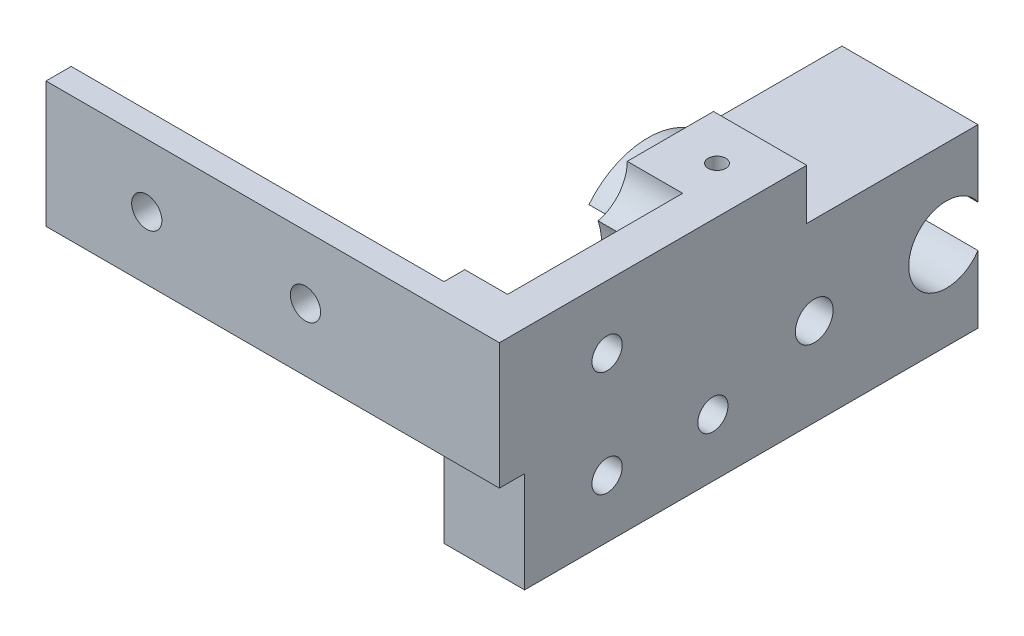
ISO-10303-21;
HEADER;
FILE_DESCRIPTION(('STEP AP214'),'2;1');
FILE_NAME('part.step','',(''),(''),'','','');
FILE_SCHEMA(('AUTOMOTIVE_DESIGN { 1 0 10303 214 1 1 1 1 }'));
ENDSEC;
DATA;
#1=APPLICATION_CONTEXT('core data for automotive mechanical design processes');
#2=APPLICATION_PROTOCOL_DEFINITION('international standard','automotive_design',2000,#1);
#3=PRODUCT_CONTEXT('',#1,'mechanical');
#4=PRODUCT('Part','Part','',(#3));
#5=PRODUCT_RELATED_PRODUCT_CATEGORY('part','',(#4));
#6=PRODUCT_DEFINITION_FORMATION('','',#4);
#7=PRODUCT_DEFINITION_CONTEXT('part definition',#1,'design');
#8=PRODUCT_DEFINITION('design','',#6,#7);
#9=PRODUCT_DEFINITION_SHAPE('','',#8);
#10=(LENGTH_UNIT() NAMED_UNIT(*) SI_UNIT(.MILLI.,.METRE.));
#11=(NAMED_UNIT(*) PLANE_ANGLE_UNIT() SI_UNIT($,.RADIAN.));
#12=(NAMED_UNIT(*) SI_UNIT($,.STERADIAN.) SOLID_ANGLE_UNIT());
#13=UNCERTAINTY_MEASURE_WITH_UNIT(LENGTH_MEASURE(1.E-05),#10,'distance_accuracy_value','');
#14=(GEOMETRIC_REPRESENTATION_CONTEXT(3) GLOBAL_UNCERTAINTY_ASSIGNED_CONTEXT((#13)) GLOBAL_UNIT_ASSIGNED_CONTEXT((#10,
#11,#12)) REPRESENTATION_CONTEXT('',''));
#15=CARTESIAN_POINT('',(0.,0.,0.));
#16=DIRECTION('',(0.,0.,1.));
#17=DIRECTION('',(1.,0.,0.));
#18=AXIS2_PLACEMENT_3D('',#15,#16,#17);
#19=CARTESIAN_POINT('',(1.7,-5.5,1.25));
#20=DIRECTION('',(1.,0.,0.));
#21=DIRECTION('',(0.,0.,-1.));
#22=AXIS2_PLACEMENT_3D('',#19,#20,#21);
#23=CYLINDRICAL_SURFACE('',#22,0.6);
#24=CARTESIAN_POINT('',(2.9,-5.5,1.25));
#25=DIRECTION('',(1.,0.,0.));
#26=DIRECTION('',(0.,0.,-1.));
#27=AXIS2_PLACEMENT_3D('',#24,#25,#26);
#28=CIRCLE('',#27,0.6);
#29=CARTESIAN_POINT('',(2.9,-5.5,0.650000000000001));
#30=VERTEX_POINT('',#29);
#31=EDGE_CURVE('E307',#30,#30,#28,.T.);
#32=ORIENTED_EDGE('',*,*,#31,.F.);
#33=EDGE_LOOP('',(#32));
#34=FACE_BOUND('',#33,.T.);
#35=CARTESIAN_POINT('',(4.9,-5.5,1.25));
#36=DIRECTION('',(1.,0.,0.));
#37=DIRECTION('',(0.,0.,-1.));
#38=AXIS2_PLACEMENT_3D('',#35,#36,#37);
#39=CIRCLE('',#38,0.6);
#40=CARTESIAN_POINT('',(4.9,-5.5,0.650000000000001));
#41=VERTEX_POINT('',#40);
#42=EDGE_CURVE('E73',#41,#41,#39,.F.);
#43=ORIENTED_EDGE('',*,*,#42,.F.);
#44=EDGE_LOOP('',(#43));
#45=FACE_BOUND('',#44,.T.);
#46=ADVANCED_FACE('F69',(#34,#45),#23,.F.);
#47=CARTESIAN_POINT('',(3.4,-6.7,10.5249223594996));
#48=DIRECTION('',(-1.,0.,0.));
#49=DIRECTION('',(0.,0.,1.));
#50=AXIS2_PLACEMENT_3D('',#47,#48,#49);
#51=CYLINDRICAL_SURFACE('',#50,3.5);
#52=CARTESIAN_POINT('',(3.4,-6.7,10.5249223594996));
#53=DIRECTION('',(1.,0.,0.));
#54=DIRECTION('',(0.,0.,-1.));
#55=AXIS2_PLACEMENT_3D('',#52,#53,#54);
#56=CIRCLE('',#55,3.5);
#57=CARTESIAN_POINT('',(3.4,-9.,7.88674116784504));
#58=VERTEX_POINT('',#57);
#59=CARTESIAN_POINT('',(3.4,-5.93787261677585,7.10890686601311));
#60=VERTEX_POINT('',#59);
#61=EDGE_CURVE('E424',#58,#60,#56,.T.);
#62=ORIENTED_EDGE('',*,*,#61,.T.);
#63=DIRECTION('',(-1.,0.,0.));
#64=VECTOR('',#63,1.);
#65=CARTESIAN_POINT('',(5.,-5.93787261677585,7.10890686601311));
#66=LINE('',#65,#64);
#67=CARTESIAN_POINT('',(1.7,-5.93787261677584,7.10890686601311));
#68=VERTEX_POINT('',#67);
#69=EDGE_CURVE('E328',#60,#68,#66,.T.);
#70=ORIENTED_EDGE('',*,*,#69,.T.);
#71=CARTESIAN_POINT('',(1.7,-6.7,10.5249223594996));
#72=DIRECTION('',(1.,0.,0.));
#73=DIRECTION('',(0.,0.,-1.));
#74=AXIS2_PLACEMENT_3D('',#71,#72,#73);
#75=CIRCLE('',#74,3.5);
#76=CARTESIAN_POINT('',(1.7,-8.34957819238067,7.43803204929712));
#77=VERTEX_POINT('',#76);
#78=EDGE_CURVE('E78',#77,#68,#75,.T.);
#79=ORIENTED_EDGE('',*,*,#78,.F.);
#80=DIRECTION('',(-1.,0.,0.));
#81=VECTOR('',#80,1.);
#82=CARTESIAN_POINT('',(12.3258774735219,-8.34957819238067,7.43803204929712));
#83=LINE('',#82,#81);
#84=CARTESIAN_POINT('',(2.9,-8.34957819238067,7.43803204929712));
#85=VERTEX_POINT('',#84);
#86=EDGE_CURVE('E345',#85,#77,#83,.T.);
#87=ORIENTED_EDGE('',*,*,#86,.F.);
#88=CARTESIAN_POINT('',(2.9,-6.7,10.5249223594996));
#89=DIRECTION('',(1.,0.,0.));
#90=DIRECTION('',(0.,0.,-1.));
#91=AXIS2_PLACEMENT_3D('',#88,#89,#90);
#92=CIRCLE('',#91,3.5);
#93=CARTESIAN_POINT('',(2.9,-9.,7.88674116784504));
#94=VERTEX_POINT('',#93);
#95=EDGE_CURVE('E346',#94,#85,#92,.T.);
#96=ORIENTED_EDGE('',*,*,#95,.F.);
#97=DIRECTION('',(-1.,0.,0.));
#98=VECTOR('',#97,1.);
#99=CARTESIAN_POINT('',(3.4,-9.,7.88674116784504));
#100=LINE('',#99,#98);
#101=EDGE_CURVE('E432',#58,#94,#100,.T.);
#102=ORIENTED_EDGE('',*,*,#101,.F.);
#103=EDGE_LOOP('',(#62,#70,#79,#87,#96,#102));
#104=FACE_BOUND('',#103,.T.);
#105=ADVANCED_FACE('F568',(#104),#51,.F.);
#106=CARTESIAN_POINT('',(1.7,-5.46705935601327,7.24927626011624));
#107=VERTEX_POINT('',#106);
#108=CARTESIAN_POINT('',(1.7,-3.62933337224518,8.84533715439902));
#109=VERTEX_POINT('',#108);
#110=EDGE_CURVE('E486',#107,#109,#75,.T.);
#111=ORIENTED_EDGE('',*,*,#110,.F.);
#112=DIRECTION('',(-1.,0.,0.));
#113=VECTOR('',#112,1.);
#114=CARTESIAN_POINT('',(5.,-5.46705935601326,7.24927626011624));
#115=LINE('',#114,#113);
#116=CARTESIAN_POINT('',(3.4,-5.46705935601326,7.24927626011624));
#117=VERTEX_POINT('',#116);
#118=EDGE_CURVE('E323',#107,#117,#115,.F.);
#119=ORIENTED_EDGE('',*,*,#118,.T.);
#120=CARTESIAN_POINT('',(3.4,-3.41671842700025,9.31246117974983));
#121=VERTEX_POINT('',#120);
#122=EDGE_CURVE('E423',#117,#121,#56,.T.);
#123=ORIENTED_EDGE('',*,*,#122,.T.);
#124=DIRECTION('',(-1.,0.,0.));
#125=VECTOR('',#124,1.);
#126=CARTESIAN_POINT('',(13.3812398038726,-3.41671842700025,9.31246117974983));
#127=LINE('',#126,#125);
#128=CARTESIAN_POINT('',(2.9,-3.41671842700025,9.31246117974983));
#129=VERTEX_POINT('',#128);
#130=EDGE_CURVE('E407',#121,#129,#127,.T.);
#131=ORIENTED_EDGE('',*,*,#130,.T.);
#132=CARTESIAN_POINT('',(2.9,-6.7,10.5249223594996));
#133=DIRECTION('',(1.,0.,0.));
#134=DIRECTION('',(0.,0.,-1.));
#135=AXIS2_PLACEMENT_3D('',#132,#133,#134);
#136=CIRCLE('',#135,3.5);
#137=CARTESIAN_POINT('',(2.9,-3.62933337224518,8.84533715439902));
#138=VERTEX_POINT('',#137);
#139=EDGE_CURVE('E338',#138,#129,#136,.T.);
#140=ORIENTED_EDGE('',*,*,#139,.F.);
#141=DIRECTION('',(-1.,0.,0.));
#142=VECTOR('',#141,1.);
#143=CARTESIAN_POINT('',(12.3258774735219,-3.62933337224518,8.84533715439902));
#144=LINE('',#143,#142);
#145=EDGE_CURVE('E348',#138,#109,#144,.T.);
#146=ORIENTED_EDGE('',*,*,#145,.T.);
#147=EDGE_LOOP('',(#111,#119,#123,#131,#140,#146));
#148=FACE_BOUND('',#147,.T.);
#149=ADVANCED_FACE('F574',(#148),#51,.F.);
#150=CARTESIAN_POINT('',(6.8,-2.5,14.7249223594996));
#151=DIRECTION('',(-1.,0.,0.));
#152=DIRECTION('',(0.,0.,1.));
#153=AXIS2_PLACEMENT_3D('',#150,#151,#152);
#154=CYLINDRICAL_SURFACE('',#153,3.5);
#155=CARTESIAN_POINT('',(4.6,-2.5,14.7249223594996));
#156=DIRECTION('',(1.,0.,0.));
#157=DIRECTION('',(0.,0.,1.));
#158=AXIS2_PLACEMENT_3D('',#155,#156,#157);
#159=CIRCLE('',#158,3.5);
#160=CARTESIAN_POINT('',(4.6,-3.86335766733239,11.5013752649273));
#161=VERTEX_POINT('',#160);
#162=CARTESIAN_POINT('',(4.6,-1.46794565851193,11.3805444149163));
#163=VERTEX_POINT('',#162);
#164=EDGE_CURVE('E379',#161,#163,#159,.T.);
#165=ORIENTED_EDGE('',*,*,#164,.F.);
#166=DIRECTION('',(-1.,0.,0.));
#167=VECTOR('',#166,1.);
#168=CARTESIAN_POINT('',(6.88722282847491,-3.86335766733239,11.5013752649273));
#169=LINE('',#168,#167);
#170=CARTESIAN_POINT('',(3.4,-3.86335766733239,11.5013752649273));
#171=VERTEX_POINT('',#170);
#172=EDGE_CURVE('E361',#161,#171,#169,.T.);
#173=ORIENTED_EDGE('',*,*,#172,.T.);
#174=CARTESIAN_POINT('',(3.4,-2.5,14.7249223594996));
#175=DIRECTION('',(1.,0.,0.));
#176=DIRECTION('',(0.,0.,-1.));
#177=AXIS2_PLACEMENT_3D('',#174,#175,#176);
#178=CIRCLE('',#177,3.5);
#179=CARTESIAN_POINT('',(3.4,-4.6,11.9249223594996));
#180=VERTEX_POINT('',#179);
#181=EDGE_CURVE('E427',#180,#171,#178,.T.);
#182=ORIENTED_EDGE('',*,*,#181,.F.);
#183=DIRECTION('',(-1.,0.,0.));
#184=VECTOR('',#183,1.);
#185=CARTESIAN_POINT('',(2.55,-4.6,11.9249223594996));
#186=LINE('',#185,#184);
#187=CARTESIAN_POINT('',(5.1,-4.6,11.9249223594996));
#188=VERTEX_POINT('',#187);
#189=EDGE_CURVE('E482',#180,#188,#186,.F.);
#190=ORIENTED_EDGE('',*,*,#189,.T.);
#191=CARTESIAN_POINT('',(5.1,-2.5,14.7249223594996));
#192=DIRECTION('',(1.,0.,0.));
#193=DIRECTION('',(0.,0.,-1.));
#194=AXIS2_PLACEMENT_3D('',#191,#192,#193);
#195=CIRCLE('',#194,3.5);
#196=CARTESIAN_POINT('',(5.1,-3.73444985669509,18.));
#197=VERTEX_POINT('',#196);
#198=EDGE_CURVE('E479',#197,#188,#195,.T.);
#199=ORIENTED_EDGE('',*,*,#198,.F.);
#200=DIRECTION('',(-1.,0.,0.));
#201=VECTOR('',#200,1.);
#202=CARTESIAN_POINT('',(6.8,-3.73444985669509,18.));
#203=LINE('',#202,#201);
#204=CARTESIAN_POINT('',(6.8,-3.73444985669509,18.));
#205=VERTEX_POINT('',#204);
#206=EDGE_CURVE('E454',#197,#205,#203,.F.);
#207=ORIENTED_EDGE('',*,*,#206,.T.);
#208=CARTESIAN_POINT('',(6.8,-2.5,14.7249223594996));
#209=DIRECTION('',(1.,0.,0.));
#210=DIRECTION('',(0.,0.,-1.));
#211=AXIS2_PLACEMENT_3D('',#208,#209,#210);
#212=CIRCLE('',#211,3.5);
#213=CARTESIAN_POINT('',(6.8,-1.46794565851193,11.3805444149163));
#214=VERTEX_POINT('',#213);
#215=EDGE_CURVE('E448',#205,#214,#212,.T.);
#216=ORIENTED_EDGE('',*,*,#215,.T.);
#217=DIRECTION('',(-1.,0.,0.));
#218=VECTOR('',#217,1.);
#219=CARTESIAN_POINT('',(3.4,-1.46794565851193,11.3805444149163));
#220=LINE('',#219,#218);
#221=EDGE_CURVE('E390',#214,#163,#220,.T.);
#222=ORIENTED_EDGE('',*,*,#221,.T.);
#223=EDGE_LOOP('',(#165,#173,#182,#190,#199,#207,#216,#222));
#224=FACE_BOUND('',#223,.T.);
#225=ADVANCED_FACE('F507',(#224),#154,.F.);
#226=CARTESIAN_POINT('',(3.4,-6.7,10.5249223594996));
#227=DIRECTION('',(1.,0.,0.));
#228=DIRECTION('',(0.,0.,-1.));
#229=AXIS2_PLACEMENT_3D('',#226,#227,#228);
#230=PLANE('',#229);
#231=CARTESIAN_POINT('',(3.4,-6.7,10.5249223594996));
#232=DIRECTION('',(1.,0.,0.));
#233=DIRECTION('',(0.,0.,-1.));
#234=AXIS2_PLACEMENT_3D('',#231,#232,#233);
#235=CIRCLE('',#234,0.6);
#236=CARTESIAN_POINT('',(3.4,-6.7,9.92492235949962));
#237=VERTEX_POINT('',#236);
#238=EDGE_CURVE('E331',#237,#237,#235,.F.);
#239=ORIENTED_EDGE('',*,*,#238,.F.);
#240=EDGE_LOOP('',(#239));
#241=FACE_BOUND('',#240,.T.);
#242=CARTESIAN_POINT('',(3.4,-5.5,6.50000000000003));
#243=DIRECTION('',(1.,0.,0.));
#244=DIRECTION('',(0.,0.,-1.));
#245=AXIS2_PLACEMENT_3D('',#242,#243,#244);
#246=CIRCLE('',#245,0.75);
#247=EDGE_CURVE('E326',#60,#117,#246,.F.);
#248=ORIENTED_EDGE('',*,*,#247,.F.);
#249=ORIENTED_EDGE('',*,*,#61,.F.);
#250=DIRECTION('',(0.,0.,1.));
#251=VECTOR('',#250,1.);
#252=CARTESIAN_POINT('',(3.4,-9.,0.));
#253=LINE('',#252,#251);
#254=CARTESIAN_POINT('',(3.4,-9.,12.086741167845));
#255=VERTEX_POINT('',#254);
#256=EDGE_CURVE('E430',#58,#255,#253,.T.);
#257=ORIENTED_EDGE('',*,*,#256,.T.);
#258=CARTESIAN_POINT('',(3.4,-6.7,14.7249223594996));
#259=DIRECTION('',(1.,0.,0.));
#260=DIRECTION('',(0.,0.,-1.));
#261=AXIS2_PLACEMENT_3D('',#258,#259,#260);
#262=CIRCLE('',#261,3.5);
#263=EDGE_CURVE('E484',#255,#180,#262,.T.);
#264=ORIENTED_EDGE('',*,*,#263,.T.);
#265=ORIENTED_EDGE('',*,*,#181,.T.);
#266=CARTESIAN_POINT('',(3.4,-6.7,10.5249223594996));
#267=DIRECTION('',(-1.,0.,0.));
#268=DIRECTION('',(0.,0.,1.));
#269=AXIS2_PLACEMENT_3D('',#266,#267,#268);
#270=CIRCLE('',#269,3.);
#271=CARTESIAN_POINT('',(3.4,-3.85042180761933,9.58689031020253));
#272=VERTEX_POINT('',#271);
#273=EDGE_CURVE('E357',#171,#272,#270,.T.);
#274=ORIENTED_EDGE('',*,*,#273,.T.);
#275=CARTESIAN_POINT('',(3.4,-5.5,6.50000000000003));
#276=DIRECTION('',(-1.,0.,0.));
#277=DIRECTION('',(0.,0.,1.));
#278=AXIS2_PLACEMENT_3D('',#275,#276,#277);
#279=CIRCLE('',#278,3.5);
#280=EDGE_CURVE('E344',#272,#121,#279,.T.);
#281=ORIENTED_EDGE('',*,*,#280,.T.);
#282=ORIENTED_EDGE('',*,*,#122,.F.);
#283=EDGE_LOOP('',(#248,#249,#257,#264,#265,#274,#281,#282));
#284=FACE_BOUND('',#283,.T.);
#285=ADVANCED_FACE('F547',(#241,#284),#230,.F.);
#286=CARTESIAN_POINT('',(8.3,0.,0.));
#287=DIRECTION('',(0.,-1.,0.));
#288=DIRECTION('',(0.,0.,-1.));
#289=AXIS2_PLACEMENT_3D('',#286,#287,#288);
#290=PLANE('',#289);
#291=CARTESIAN_POINT('',(6.45,0.,8.51247188076329));
#292=DIRECTION('',(0.,1.,0.));
#293=DIRECTION('',(0.,0.,1.));
#294=AXIS2_PLACEMENT_3D('',#291,#292,#293);
#295=CIRCLE('',#294,0.35);
#296=CARTESIAN_POINT('',(6.45,0.,8.86247188076329));
#297=VERTEX_POINT('',#296);
#298=EDGE_CURVE('E955',#297,#297,#295,.T.);
#299=ORIENTED_EDGE('',*,*,#298,.F.);
#300=EDGE_LOOP('',(#299));
#301=FACE_BOUND('',#300,.T.);
#302=DIRECTION('',(0.,0.,-1.));
#303=VECTOR('',#302,1.);
#304=CARTESIAN_POINT('',(4.6,0.,10.2249437615266));
#305=LINE('',#304,#303);
#306=CARTESIAN_POINT('',(4.6,0.,10.2249437615266));
#307=VERTEX_POINT('',#306);
#308=CARTESIAN_POINT('',(4.6,0.,6.8));
#309=VERTEX_POINT('',#308);
#310=EDGE_CURVE('E370',#307,#309,#305,.T.);
#311=ORIENTED_EDGE('',*,*,#310,.F.);
#312=DIRECTION('',(-1.,0.,0.));
#313=VECTOR('',#312,1.);
#314=CARTESIAN_POINT('',(11.0426406871193,0.,10.2249437615266));
#315=LINE('',#314,#313);
#316=CARTESIAN_POINT('',(6.8,0.,10.2249437615266));
#317=VERTEX_POINT('',#316);
#318=EDGE_CURVE('E387',#317,#307,#315,.T.);
#319=ORIENTED_EDGE('',*,*,#318,.F.);
#320=DIRECTION('',(0.,0.,1.));
#321=VECTOR('',#320,1.);
#322=CARTESIAN_POINT('',(6.8,0.,0.));
#323=LINE('',#322,#321);
#324=CARTESIAN_POINT('',(6.8,0.,17.1744121022828));
#325=VERTEX_POINT('',#324);
#326=EDGE_CURVE('E459',#317,#325,#323,.T.);
#327=ORIENTED_EDGE('',*,*,#326,.T.);
#328=DIRECTION('',(-1.,0.,0.));
#329=VECTOR('',#328,1.);
#330=CARTESIAN_POINT('',(6.8,0.,17.1744121022828));
#331=LINE('',#330,#329);
#332=CARTESIAN_POINT('',(5.1,0.,17.1744121022828));
#333=VERTEX_POINT('',#332);
#334=EDGE_CURVE('E456',#333,#325,#331,.F.);
#335=ORIENTED_EDGE('',*,*,#334,.F.);
#336=DIRECTION('',(0.,0.,1.));
#337=VECTOR('',#336,1.);
#338=CARTESIAN_POINT('',(5.1,0.,0.));
#339=LINE('',#338,#337);
#340=CARTESIAN_POINT('',(5.1,0.,18.));
#341=VERTEX_POINT('',#340);
#342=EDGE_CURVE('E415',#333,#341,#339,.T.);
#343=ORIENTED_EDGE('',*,*,#342,.T.);
#344=DIRECTION('',(-1.,0.,0.));
#345=VECTOR('',#344,1.);
#346=CARTESIAN_POINT('',(8.3,0.,18.));
#347=LINE('',#346,#345);
#348=CARTESIAN_POINT('',(-9.7,0.,18.));
#349=VERTEX_POINT('',#348);
#350=EDGE_CURVE('E277',#341,#349,#347,.T.);
#351=ORIENTED_EDGE('',*,*,#350,.T.);
#352=DIRECTION('',(0.,0.,-1.));
#353=VECTOR('',#352,1.);
#354=CARTESIAN_POINT('',(-9.7,0.,19.));
#355=LINE('',#354,#353);
#356=CARTESIAN_POINT('',(-9.7,0.,19.));
#357=VERTEX_POINT('',#356);
#358=EDGE_CURVE('E291',#357,#349,#355,.T.);
#359=ORIENTED_EDGE('',*,*,#358,.F.);
#360=DIRECTION('',(-1.,0.,0.));
#361=VECTOR('',#360,1.);
#362=CARTESIAN_POINT('',(8.3,0.,19.));
#363=LINE('',#362,#361);
#364=CARTESIAN_POINT('',(8.3,0.,19.));
#365=VERTEX_POINT('',#364);
#366=EDGE_CURVE('E259',#365,#357,#363,.T.);
#367=ORIENTED_EDGE('',*,*,#366,.F.);
#368=DIRECTION('',(0.,0.,1.));
#369=VECTOR('',#368,1.);
#370=CARTESIAN_POINT('',(8.3,0.,0.));
#371=LINE('',#370,#369);
#372=CARTESIAN_POINT('',(8.3,0.,6.8));
#373=VERTEX_POINT('',#372);
#374=EDGE_CURVE('E275',#373,#365,#371,.T.);
#375=ORIENTED_EDGE('',*,*,#374,.F.);
#376=DIRECTION('',(1.,0.,0.));
#377=VECTOR('',#376,1.);
#378=CARTESIAN_POINT('',(2.9,0.,6.8));
#379=LINE('',#378,#377);
#380=EDGE_CURVE('E393',#309,#373,#379,.T.);
#381=ORIENTED_EDGE('',*,*,#380,.F.);
#382=EDGE_LOOP('',(#311,#319,#327,#335,#343,#351,#359,#367,#375,#381));
#383=FACE_BOUND('',#382,.T.);
#384=ADVANCED_FACE('F71',(#301,#383),#290,.F.);
#385=CARTESIAN_POINT('',(2.9,-2.,6.8));
#386=DIRECTION('',(0.,0.,1.));
#387=DIRECTION('',(0.,-1.,0.));
#388=AXIS2_PLACEMENT_3D('',#385,#386,#387);
#389=PLANE('',#388);
#390=DIRECTION('',(0.,-1.,0.));
#391=VECTOR('',#390,1.);
#392=CARTESIAN_POINT('',(4.6,0.,6.8));
#393=LINE('',#392,#391);
#394=CARTESIAN_POINT('',(4.6,-2.,6.8));
#395=VERTEX_POINT('',#394);
#396=EDGE_CURVE('E372',#309,#395,#393,.T.);
#397=ORIENTED_EDGE('',*,*,#396,.F.);
#398=ORIENTED_EDGE('',*,*,#380,.T.);
#399=DIRECTION('',(0.,1.,0.));
#400=VECTOR('',#399,1.);
#401=CARTESIAN_POINT('',(8.3,-2.,6.8));
#402=LINE('',#401,#400);
#403=CARTESIAN_POINT('',(8.3,-2.,6.8));
#404=VERTEX_POINT('',#403);
#405=EDGE_CURVE('E404',#404,#373,#402,.T.);
#406=ORIENTED_EDGE('',*,*,#405,.F.);
#407=DIRECTION('',(1.,0.,0.));
#408=VECTOR('',#407,1.);
#409=CARTESIAN_POINT('',(2.9,-2.,6.8));
#410=LINE('',#409,#408);
#411=EDGE_CURVE('E394',#395,#404,#410,.T.);
#412=ORIENTED_EDGE('',*,*,#411,.F.);
#413=EDGE_LOOP('',(#397,#398,#406,#412));
#414=FACE_BOUND('',#413,.T.);
#415=ADVANCED_FACE('F527',(#414),#389,.F.);
#416=CARTESIAN_POINT('',(0.,-2.,0.));
#417=DIRECTION('',(0.,1.,0.));
#418=DIRECTION('',(0.,0.,1.));
#419=AXIS2_PLACEMENT_3D('',#416,#417,#418);
#420=PLANE('',#419);
#421=DIRECTION('',(0.,0.,-1.));
#422=VECTOR('',#421,1.);
#423=CARTESIAN_POINT('',(2.9,-2.,6.8));
#424=LINE('',#423,#422);
#425=CARTESIAN_POINT('',(2.9,-2.00000000000001,6.50000000000003));
#426=VERTEX_POINT('',#425);
#427=CARTESIAN_POINT('',(2.9,-2.,0.));
#428=VERTEX_POINT('',#427);
#429=EDGE_CURVE('E401',#426,#428,#424,.T.);
#430=ORIENTED_EDGE('',*,*,#429,.F.);
#431=DIRECTION('',(-1.,0.,0.));
#432=VECTOR('',#431,1.);
#433=CARTESIAN_POINT('',(4.6,-2.00000000000001,6.50000000000003));
#434=LINE('',#433,#432);
#435=CARTESIAN_POINT('',(4.6,-2.00000000000001,6.50000000000003));
#436=VERTEX_POINT('',#435);
#437=EDGE_CURVE('E381',#436,#426,#434,.T.);
#438=ORIENTED_EDGE('',*,*,#437,.F.);
#439=DIRECTION('',(0.,0.,-1.));
#440=VECTOR('',#439,1.);
#441=CARTESIAN_POINT('',(4.6,-2.,6.8));
#442=LINE('',#441,#440);
#443=EDGE_CURVE('E374',#395,#436,#442,.T.);
#444=ORIENTED_EDGE('',*,*,#443,.F.);
#445=ORIENTED_EDGE('',*,*,#411,.T.);
#446=DIRECTION('',(0.,0.,-1.));
#447=VECTOR('',#446,1.);
#448=CARTESIAN_POINT('',(8.3,-2.,6.8));
#449=LINE('',#448,#447);
#450=CARTESIAN_POINT('',(8.3,-2.,0.));
#451=VERTEX_POINT('',#450);
#452=EDGE_CURVE('E396',#404,#451,#449,.T.);
#453=ORIENTED_EDGE('',*,*,#452,.T.);
#454=DIRECTION('',(1.,0.,0.));
#455=VECTOR('',#454,1.);
#456=CARTESIAN_POINT('',(2.9,-2.,0.));
#457=LINE('',#456,#455);
#458=EDGE_CURVE('E398',#428,#451,#457,.T.);
#459=ORIENTED_EDGE('',*,*,#458,.F.);
#460=EDGE_LOOP('',(#430,#438,#444,#445,#453,#459));
#461=FACE_BOUND('',#460,.T.);
#462=ADVANCED_FACE('F532',(#461),#420,.T.);
#463=CARTESIAN_POINT('',(11.0426406871193,-0.00801284112458053,11.7249223594996));
#464=DIRECTION('',(-1.,0.,0.));
#465=DIRECTION('',(0.,0.,1.));
#466=AXIS2_PLACEMENT_3D('',#463,#464,#465);
#467=CYLINDRICAL_SURFACE('',#466,1.5);
#468=ORIENTED_EDGE('',*,*,#318,.T.);
#469=CARTESIAN_POINT('',(4.6,-0.00801284112458053,11.7249223594996));
#470=DIRECTION('',(1.,0.,0.));
#471=DIRECTION('',(0.,0.,1.));
#472=AXIS2_PLACEMENT_3D('',#469,#470,#471);
#473=CIRCLE('',#472,1.5);
#474=EDGE_CURVE('E368',#163,#307,#473,.T.);
#475=ORIENTED_EDGE('',*,*,#474,.F.);
#476=ORIENTED_EDGE('',*,*,#221,.F.);
#477=CARTESIAN_POINT('',(6.8,-0.00801284112458053,11.7249223594996));
#478=DIRECTION('',(1.,0.,0.));
#479=DIRECTION('',(0.,0.,-1.));
#480=AXIS2_PLACEMENT_3D('',#477,#478,#479);
#481=CIRCLE('',#480,1.5);
#482=EDGE_CURVE('E384',#214,#317,#481,.T.);
#483=ORIENTED_EDGE('',*,*,#482,.T.);
#484=EDGE_LOOP('',(#468,#475,#476,#483));
#485=FACE_BOUND('',#484,.T.);
#486=ADVANCED_FACE('F515',(#485),#467,.F.);
#487=CARTESIAN_POINT('',(8.3,0.,0.));
#488=DIRECTION('',(0.,0.,-1.));
#489=DIRECTION('',(-1.,0.,0.));
#490=AXIS2_PLACEMENT_3D('',#487,#488,#489);
#491=PLANE('',#490);
#492=DIRECTION('',(1.,0.,0.));
#493=VECTOR('',#492,1.);
#494=CARTESIAN_POINT('',(-1.34264068711929,-4.67084380241115,0.));
#495=LINE('',#494,#493);
#496=CARTESIAN_POINT('',(4.9,-4.67084380241115,0.));
#497=VERTEX_POINT('',#496);
#498=CARTESIAN_POINT('',(8.3,-4.67084380241115,0.));
#499=VERTEX_POINT('',#498);
#500=EDGE_CURVE('E305',#497,#499,#495,.T.);
#501=ORIENTED_EDGE('',*,*,#500,.F.);
#502=DIRECTION('',(0.,-1.,0.));
#503=VECTOR('',#502,1.);
#504=CARTESIAN_POINT('',(4.9,0.,0.));
#505=LINE('',#504,#503);
#506=CARTESIAN_POINT('',(4.9,-6.32915619758885,0.));
#507=VERTEX_POINT('',#506);
#508=EDGE_CURVE('E300',#497,#507,#505,.T.);
#509=ORIENTED_EDGE('',*,*,#508,.T.);
#510=DIRECTION('',(1.,0.,0.));
#511=VECTOR('',#510,1.);
#512=CARTESIAN_POINT('',(-1.34264068711929,-6.32915619758885,0.));
#513=LINE('',#512,#511);
#514=CARTESIAN_POINT('',(8.3,-6.32915619758885,0.));
#515=VERTEX_POINT('',#514);
#516=EDGE_CURVE('E303',#515,#507,#513,.F.);
#517=ORIENTED_EDGE('',*,*,#516,.F.);
#518=DIRECTION('',(0.,-1.,0.));
#519=VECTOR('',#518,1.);
#520=CARTESIAN_POINT('',(8.3,0.,0.));
#521=LINE('',#520,#519);
#522=CARTESIAN_POINT('',(8.3,-9.,0.));
#523=VERTEX_POINT('',#522);
#524=EDGE_CURVE('E466',#515,#523,#521,.T.);
#525=ORIENTED_EDGE('',*,*,#524,.T.);
#526=DIRECTION('',(-1.,0.,0.));
#527=VECTOR('',#526,1.);
#528=CARTESIAN_POINT('',(8.3,-9.,0.));
#529=LINE('',#528,#527);
#530=CARTESIAN_POINT('',(2.9,-9.,0.));
#531=VERTEX_POINT('',#530);
#532=EDGE_CURVE('E470',#523,#531,#529,.T.);
#533=ORIENTED_EDGE('',*,*,#532,.T.);
#534=DIRECTION('',(0.,-1.,0.));
#535=VECTOR('',#534,1.);
#536=CARTESIAN_POINT('',(2.9,0.,0.));
#537=LINE('',#536,#535);
#538=EDGE_CURVE('E412',#428,#531,#537,.T.);
#539=ORIENTED_EDGE('',*,*,#538,.F.);
#540=ORIENTED_EDGE('',*,*,#458,.T.);
#541=EDGE_CURVE('E467',#451,#499,#521,.T.);
#542=ORIENTED_EDGE('',*,*,#541,.T.);
#543=EDGE_LOOP('',(#501,#509,#517,#525,#533,#539,#540,#542));
#544=FACE_BOUND('',#543,.T.);
#545=ADVANCED_FACE('F609',(#544),#491,.T.);
#546=CARTESIAN_POINT('',(2.9,0.,0.));
#547=DIRECTION('',(1.,0.,0.));
#548=DIRECTION('',(0.,0.,-1.));
#549=AXIS2_PLACEMENT_3D('',#546,#547,#548);
#550=PLANE('',#549);
#551=ORIENTED_EDGE('',*,*,#31,.T.);
#552=EDGE_LOOP('',(#551));
#553=FACE_BOUND('',#552,.T.);
#554=ORIENTED_EDGE('',*,*,#429,.T.);
#555=ORIENTED_EDGE('',*,*,#538,.T.);
#556=DIRECTION('',(0.,0.,1.));
#557=VECTOR('',#556,1.);
#558=CARTESIAN_POINT('',(2.9,-9.,0.));
#559=LINE('',#558,#557);
#560=EDGE_CURVE('E410',#531,#94,#559,.T.);
#561=ORIENTED_EDGE('',*,*,#560,.T.);
#562=ORIENTED_EDGE('',*,*,#95,.T.);
#563=CARTESIAN_POINT('',(2.9,-5.5,6.50000000000003));
#564=DIRECTION('',(1.,0.,0.));
#565=DIRECTION('',(0.,0.,-1.));
#566=AXIS2_PLACEMENT_3D('',#563,#564,#565);
#567=CIRCLE('',#566,3.);
#568=EDGE_CURVE('E349',#85,#138,#567,.T.);
#569=ORIENTED_EDGE('',*,*,#568,.T.);
#570=ORIENTED_EDGE('',*,*,#139,.T.);
#571=CARTESIAN_POINT('',(2.9,-5.5,6.50000000000003));
#572=DIRECTION('',(1.,0.,0.));
#573=DIRECTION('',(0.,0.,-1.));
#574=AXIS2_PLACEMENT_3D('',#571,#572,#573);
#575=CIRCLE('',#574,3.5);
#576=EDGE_CURVE('E13',#129,#426,#575,.F.);
#577=ORIENTED_EDGE('',*,*,#576,.T.);
#578=EDGE_LOOP('',(#554,#555,#561,#562,#569,#570,#577));
#579=FACE_BOUND('',#578,.T.);
#580=ADVANCED_FACE('F617',(#553,#579),#550,.F.);
#581=CARTESIAN_POINT('',(1.7,-5.5,6.50000000000003));
#582=DIRECTION('',(1.,0.,0.));
#583=DIRECTION('',(0.,0.,-1.));
#584=AXIS2_PLACEMENT_3D('',#581,#582,#583);
#585=PLANE('',#584);
#586=CARTESIAN_POINT('',(1.7,-5.5,6.50000000000003));
#587=DIRECTION('',(1.,0.,0.));
#588=DIRECTION('',(0.,0.,-1.));
#589=AXIS2_PLACEMENT_3D('',#586,#587,#588);
#590=CIRCLE('',#589,0.75);
#591=EDGE_CURVE('E318',#68,#107,#590,.T.);
#592=ORIENTED_EDGE('',*,*,#591,.T.);
#593=ORIENTED_EDGE('',*,*,#110,.T.);
#594=CARTESIAN_POINT('',(1.7,-5.5,6.50000000000003));
#595=DIRECTION('',(1.,0.,0.));
#596=DIRECTION('',(0.,0.,-1.));
#597=AXIS2_PLACEMENT_3D('',#594,#595,#596);
#598=CIRCLE('',#597,3.);
#599=EDGE_CURVE('E341',#77,#109,#598,.T.);
#600=ORIENTED_EDGE('',*,*,#599,.F.);
#601=ORIENTED_EDGE('',*,*,#78,.T.);
#602=EDGE_LOOP('',(#592,#593,#600,#601));
#603=FACE_BOUND('',#602,.T.);
#604=ADVANCED_FACE('F565',(#603),#585,.F.);
#605=CARTESIAN_POINT('',(8.3,-9.,0.));
#606=DIRECTION('',(0.,-1.,0.));
#607=DIRECTION('',(0.,0.,-1.));
#608=AXIS2_PLACEMENT_3D('',#605,#606,#607);
#609=PLANE('',#608);
#610=ORIENTED_EDGE('',*,*,#101,.T.);
#611=ORIENTED_EDGE('',*,*,#560,.F.);
#612=ORIENTED_EDGE('',*,*,#532,.F.);
#613=DIRECTION('',(0.,0.,1.));
#614=VECTOR('',#613,1.);
#615=CARTESIAN_POINT('',(8.3,-9.,0.));
#616=LINE('',#615,#614);
#617=CARTESIAN_POINT('',(8.3,-9.,18.));
#618=VERTEX_POINT('',#617);
#619=EDGE_CURVE('E463',#523,#618,#616,.T.);
#620=ORIENTED_EDGE('',*,*,#619,.T.);
#621=DIRECTION('',(-1.,0.,0.));
#622=VECTOR('',#621,1.);
#623=CARTESIAN_POINT('',(8.3,-9.,18.));
#624=LINE('',#623,#622);
#625=CARTESIAN_POINT('',(5.1,-9.,18.));
#626=VERTEX_POINT('',#625);
#627=EDGE_CURVE('E473',#618,#626,#624,.T.);
#628=ORIENTED_EDGE('',*,*,#627,.T.);
#629=DIRECTION('',(0.,0.,1.));
#630=VECTOR('',#629,1.);
#631=CARTESIAN_POINT('',(5.1,-9.,0.));
#632=LINE('',#631,#630);
#633=CARTESIAN_POINT('',(5.1,-9.,12.086741167845));
#634=VERTEX_POINT('',#633);
#635=EDGE_CURVE('E438',#634,#626,#632,.T.);
#636=ORIENTED_EDGE('',*,*,#635,.F.);
#637=DIRECTION('',(-1.,0.,0.));
#638=VECTOR('',#637,1.);
#639=CARTESIAN_POINT('',(5.1,-9.,12.086741167845));
#640=LINE('',#639,#638);
#641=EDGE_CURVE('E445',#634,#255,#640,.T.);
#642=ORIENTED_EDGE('',*,*,#641,.T.);
#643=ORIENTED_EDGE('',*,*,#256,.F.);
#644=EDGE_LOOP('',(#610,#611,#612,#620,#628,#636,#642,#643));
#645=FACE_BOUND('',#644,.T.);
#646=ADVANCED_FACE('F554',(#645),#609,.T.);
#647=CARTESIAN_POINT('',(8.3,0.,18.));
#648=DIRECTION('',(0.,0.,-1.));
#649=DIRECTION('',(-1.,0.,0.));
#650=AXIS2_PLACEMENT_3D('',#647,#648,#649);
#651=PLANE('',#650);
#652=DIRECTION('',(0.,-1.,0.));
#653=VECTOR('',#652,1.);
#654=CARTESIAN_POINT('',(8.3,0.,18.));
#655=LINE('',#654,#653);
#656=CARTESIAN_POINT('',(8.3,-5.00000000000001,18.));
#657=VERTEX_POINT('',#656);
#658=EDGE_CURVE('E86',#657,#618,#655,.T.);
#659=ORIENTED_EDGE('',*,*,#658,.F.);
#660=DIRECTION('',(-1.,0.,0.));
#661=VECTOR('',#660,1.);
#662=CARTESIAN_POINT('',(8.3,-5.00000000000001,18.));
#663=LINE('',#662,#661);
#664=CARTESIAN_POINT('',(5.1,-5.00000000000001,18.));
#665=VERTEX_POINT('',#664);
#666=EDGE_CURVE('E91',#657,#665,#663,.T.);
#667=ORIENTED_EDGE('',*,*,#666,.T.);
#668=DIRECTION('',(0.,-1.,0.));
#669=VECTOR('',#668,1.);
#670=CARTESIAN_POINT('',(5.1,0.,18.));
#671=LINE('',#670,#669);
#672=EDGE_CURVE('E441',#665,#626,#671,.T.);
#673=ORIENTED_EDGE('',*,*,#672,.T.);
#674=ORIENTED_EDGE('',*,*,#627,.F.);
#675=EDGE_LOOP('',(#659,#667,#673,#674));
#676=FACE_BOUND('',#675,.T.);
#677=ADVANCED_FACE('F558',(#676),#651,.F.);
#678=CARTESIAN_POINT('',(8.3,0.,0.));
#679=DIRECTION('',(1.,0.,0.));
#680=DIRECTION('',(0.,0.,-1.));
#681=AXIS2_PLACEMENT_3D('',#678,#679,#680);
#682=PLANE('',#681);
#683=CARTESIAN_POINT('',(8.3,-5.5,1.25));
#684=DIRECTION('',(1.,0.,0.));
#685=DIRECTION('',(0.,0.,-1.));
#686=AXIS2_PLACEMENT_3D('',#683,#684,#685);
#687=CIRCLE('',#686,1.5);
#688=EDGE_CURVE('E294',#499,#515,#687,.T.);
#689=ORIENTED_EDGE('',*,*,#688,.F.);
#690=ORIENTED_EDGE('',*,*,#541,.F.);
#691=ORIENTED_EDGE('',*,*,#452,.F.);
#692=ORIENTED_EDGE('',*,*,#405,.T.);
#693=ORIENTED_EDGE('',*,*,#374,.T.);
#694=DIRECTION('',(0.,-1.,0.));
#695=VECTOR('',#694,1.);
#696=CARTESIAN_POINT('',(8.3,0.,19.));
#697=LINE('',#696,#695);
#698=CARTESIAN_POINT('',(8.3,-5.00000000000001,19.));
#699=VERTEX_POINT('',#698);
#700=EDGE_CURVE('E265',#365,#699,#697,.T.);
#701=ORIENTED_EDGE('',*,*,#700,.T.);
#702=DIRECTION('',(0.,0.,-1.));
#703=VECTOR('',#702,1.);
#704=CARTESIAN_POINT('',(8.3,-5.00000000000001,19.));
#705=LINE('',#704,#703);
#706=EDGE_CURVE('E250',#699,#657,#705,.T.);
#707=ORIENTED_EDGE('',*,*,#706,.T.);
#708=ORIENTED_EDGE('',*,*,#658,.T.);
#709=ORIENTED_EDGE('',*,*,#619,.F.);
#710=ORIENTED_EDGE('',*,*,#524,.F.);
#711=EDGE_LOOP('',(#689,#690,#691,#692,#693,#701,#707,#708,#709,#710));
#712=FACE_BOUND('',#711,.T.);
#713=CARTESIAN_POINT('',(8.3,-6.7,14.7249223594996));
#714=DIRECTION('',(1.,0.,0.));
#715=DIRECTION('',(0.,0.,-1.));
#716=AXIS2_PLACEMENT_3D('',#713,#714,#715);
#717=CIRCLE('',#716,0.6);
#718=CARTESIAN_POINT('',(8.3,-6.7,14.1249223594996));
#719=VERTEX_POINT('',#718);
#720=EDGE_CURVE('E311',#719,#719,#717,.T.);
#721=ORIENTED_EDGE('',*,*,#720,.F.);
#722=EDGE_LOOP('',(#721));
#723=FACE_BOUND('',#722,.T.);
#724=CARTESIAN_POINT('',(8.3,-6.7,10.5249223594996));
#725=DIRECTION('',(1.,0.,0.));
#726=DIRECTION('',(0.,0.,-1.));
#727=AXIS2_PLACEMENT_3D('',#724,#725,#726);
#728=CIRCLE('',#727,0.6);
#729=CARTESIAN_POINT('',(8.3,-6.7,9.92492235949962));
#730=VERTEX_POINT('',#729);
#731=EDGE_CURVE('E315',#730,#730,#728,.T.);
#732=ORIENTED_EDGE('',*,*,#731,.F.);
#733=EDGE_LOOP('',(#732));
#734=FACE_BOUND('',#733,.T.);
#735=CARTESIAN_POINT('',(8.3,-5.5,6.50000000000003));
#736=DIRECTION('',(1.,0.,0.));
#737=DIRECTION('',(0.,0.,-1.));
#738=AXIS2_PLACEMENT_3D('',#735,#736,#737);
#739=CIRCLE('',#738,0.75);
#740=CARTESIAN_POINT('',(8.3,-5.5,5.75000000000003));
#741=VERTEX_POINT('',#740);
#742=EDGE_CURVE('E310',#741,#741,#739,.T.);
#743=ORIENTED_EDGE('',*,*,#742,.F.);
#744=EDGE_LOOP('',(#743));
#745=FACE_BOUND('',#744,.T.);
#746=CARTESIAN_POINT('',(8.3,-2.5,14.7249223594996));
#747=DIRECTION('',(1.,0.,0.));
#748=DIRECTION('',(0.,0.,-1.));
#749=AXIS2_PLACEMENT_3D('',#746,#747,#748);
#750=CIRCLE('',#749,0.6);
#751=CARTESIAN_POINT('',(8.3,-2.5,14.1249223594996));
#752=VERTEX_POINT('',#751);
#753=EDGE_CURVE('E335',#752,#752,#750,.T.);
#754=ORIENTED_EDGE('',*,*,#753,.F.);
#755=EDGE_LOOP('',(#754));
#756=FACE_BOUND('',#755,.T.);
#757=ADVANCED_FACE('F271',(#712,#723,#734,#745,#756),#682,.T.);
#758=CARTESIAN_POINT('',(6.8,-2.5,14.7249223594996));
#759=DIRECTION('',(1.,0.,0.));
#760=DIRECTION('',(0.,0.,-1.));
#761=AXIS2_PLACEMENT_3D('',#758,#759,#760);
#762=PLANE('',#761);
#763=CARTESIAN_POINT('',(6.8,-2.5,14.7249223594996));
#764=DIRECTION('',(1.,0.,0.));
#765=DIRECTION('',(0.,0.,-1.));
#766=AXIS2_PLACEMENT_3D('',#763,#764,#765);
#767=CIRCLE('',#766,0.6);
#768=CARTESIAN_POINT('',(6.8,-2.5,14.1249223594996));
#769=VERTEX_POINT('',#768);
#770=EDGE_CURVE('E334',#769,#769,#767,.T.);
#771=ORIENTED_EDGE('',*,*,#770,.T.);
#772=EDGE_LOOP('',(#771));
#773=FACE_BOUND('',#772,.T.);
#774=CARTESIAN_POINT('',(6.8,-1.26555014330491,18.));
#775=VERTEX_POINT('',#774);
#776=EDGE_CURVE('E451',#325,#775,#212,.T.);
#777=ORIENTED_EDGE('',*,*,#776,.F.);
#778=ORIENTED_EDGE('',*,*,#326,.F.);
#779=ORIENTED_EDGE('',*,*,#482,.F.);
#780=ORIENTED_EDGE('',*,*,#215,.F.);
#781=DIRECTION('',(0.,-1.,0.));
#782=VECTOR('',#781,1.);
#783=CARTESIAN_POINT('',(6.8,0.,18.));
#784=LINE('',#783,#782);
#785=EDGE_CURVE('E476',#775,#205,#784,.T.);
#786=ORIENTED_EDGE('',*,*,#785,.F.);
#787=EDGE_LOOP('',(#777,#778,#779,#780,#786));
#788=FACE_BOUND('',#787,.T.);
#789=ADVANCED_FACE('F511',(#773,#788),#762,.F.);
#790=CARTESIAN_POINT('',(5.1,-2.5,14.7249223594996));
#791=DIRECTION('',(1.,0.,0.));
#792=DIRECTION('',(0.,0.,-1.));
#793=AXIS2_PLACEMENT_3D('',#790,#791,#792);
#794=CIRCLE('',#793,3.5);
#795=CARTESIAN_POINT('',(5.1,-1.26555014330491,18.));
#796=VERTEX_POINT('',#795);
#797=EDGE_CURVE('E414',#333,#796,#794,.T.);
#798=ORIENTED_EDGE('',*,*,#797,.F.);
#799=ORIENTED_EDGE('',*,*,#334,.T.);
#800=ORIENTED_EDGE('',*,*,#776,.T.);
#801=DIRECTION('',(-1.,0.,0.));
#802=VECTOR('',#801,1.);
#803=CARTESIAN_POINT('',(6.8,-1.26555014330491,18.));
#804=LINE('',#803,#802);
#805=EDGE_CURVE('E452',#775,#796,#804,.T.);
#806=ORIENTED_EDGE('',*,*,#805,.T.);
#807=EDGE_LOOP('',(#798,#799,#800,#806));
#808=FACE_BOUND('',#807,.T.);
#809=ADVANCED_FACE('F497',(#808),#154,.F.);
#810=CARTESIAN_POINT('',(5.1,-6.7,14.7249223594996));
#811=DIRECTION('',(1.,0.,0.));
#812=DIRECTION('',(0.,0.,-1.));
#813=AXIS2_PLACEMENT_3D('',#810,#811,#812);
#814=PLANE('',#813);
#815=CARTESIAN_POINT('',(5.1,-6.7,14.7249223594996));
#816=DIRECTION('',(1.,0.,0.));
#817=DIRECTION('',(0.,0.,-1.));
#818=AXIS2_PLACEMENT_3D('',#815,#816,#817);
#819=CIRCLE('',#818,0.6);
#820=CARTESIAN_POINT('',(5.1,-6.7,14.1249223594996));
#821=VERTEX_POINT('',#820);
#822=EDGE_CURVE('E314',#821,#821,#819,.F.);
#823=ORIENTED_EDGE('',*,*,#822,.F.);
#824=EDGE_LOOP('',(#823));
#825=FACE_BOUND('',#824,.T.);
#826=EDGE_CURVE('E442',#197,#665,#671,.T.);
#827=ORIENTED_EDGE('',*,*,#826,.F.);
#828=ORIENTED_EDGE('',*,*,#198,.T.);
#829=CARTESIAN_POINT('',(5.1,-6.7,14.7249223594996));
#830=DIRECTION('',(1.,0.,0.));
#831=DIRECTION('',(0.,0.,-1.));
#832=AXIS2_PLACEMENT_3D('',#829,#830,#831);
#833=CIRCLE('',#832,3.5);
#834=EDGE_CURVE('E435',#634,#188,#833,.T.);
#835=ORIENTED_EDGE('',*,*,#834,.F.);
#836=ORIENTED_EDGE('',*,*,#635,.T.);
#837=ORIENTED_EDGE('',*,*,#672,.F.);
#838=EDGE_LOOP('',(#827,#828,#835,#836,#837));
#839=FACE_BOUND('',#838,.T.);
#840=ADVANCED_FACE('F493',(#825,#839),#814,.F.);
#841=CARTESIAN_POINT('',(5.1,-6.7,14.7249223594996));
#842=DIRECTION('',(-1.,0.,0.));
#843=DIRECTION('',(0.,0.,1.));
#844=AXIS2_PLACEMENT_3D('',#841,#842,#843);
#845=CYLINDRICAL_SURFACE('',#844,3.5);
#846=ORIENTED_EDGE('',*,*,#263,.F.);
#847=ORIENTED_EDGE('',*,*,#641,.F.);
#848=ORIENTED_EDGE('',*,*,#834,.T.);
#849=ORIENTED_EDGE('',*,*,#189,.F.);
#850=EDGE_LOOP('',(#846,#847,#848,#849));
#851=FACE_BOUND('',#850,.T.);
#852=ADVANCED_FACE('F496',(#851),#845,.F.);
#853=CARTESIAN_POINT('',(5.1,-6.7,14.7249223594996));
#854=DIRECTION('',(1.,0.,0.));
#855=DIRECTION('',(0.,0.,-1.));
#856=AXIS2_PLACEMENT_3D('',#853,#854,#855);
#857=PLANE('',#856);
#858=ORIENTED_EDGE('',*,*,#797,.T.);
#859=DIRECTION('',(0.,-1.,0.));
#860=VECTOR('',#859,1.);
#861=CARTESIAN_POINT('',(5.1,0.,18.));
#862=LINE('',#861,#860);
#863=EDGE_CURVE('E418',#341,#796,#862,.T.);
#864=ORIENTED_EDGE('',*,*,#863,.F.);
#865=ORIENTED_EDGE('',*,*,#342,.F.);
#866=EDGE_LOOP('',(#858,#864,#865));
#867=FACE_BOUND('',#866,.T.);
#868=ADVANCED_FACE('F616',(#867),#857,.F.);
#869=CARTESIAN_POINT('',(13.3812398038726,-5.5,6.50000000000003));
#870=DIRECTION('',(-1.,0.,0.));
#871=DIRECTION('',(0.,0.,1.));
#872=AXIS2_PLACEMENT_3D('',#869,#870,#871);
#873=CYLINDRICAL_SURFACE('',#872,3.5);
#874=ORIENTED_EDGE('',*,*,#576,.F.);
#875=ORIENTED_EDGE('',*,*,#130,.F.);
#876=ORIENTED_EDGE('',*,*,#280,.F.);
#877=DIRECTION('',(-1.,0.,0.));
#878=VECTOR('',#877,1.);
#879=CARTESIAN_POINT('',(6.88722282847491,-3.85042180761933,9.58689031020253));
#880=LINE('',#879,#878);
#881=CARTESIAN_POINT('',(4.6,-3.85042180761933,9.58689031020253));
#882=VERTEX_POINT('',#881);
#883=EDGE_CURVE('E360',#882,#272,#880,.T.);
#884=ORIENTED_EDGE('',*,*,#883,.F.);
#885=CARTESIAN_POINT('',(4.6,-5.5,6.50000000000003));
#886=DIRECTION('',(1.,0.,0.));
#887=DIRECTION('',(0.,0.,1.));
#888=AXIS2_PLACEMENT_3D('',#885,#886,#887);
#889=CIRCLE('',#888,3.5);
#890=EDGE_CURVE('E377',#436,#882,#889,.T.);
#891=ORIENTED_EDGE('',*,*,#890,.F.);
#892=ORIENTED_EDGE('',*,*,#437,.T.);
#893=EDGE_LOOP('',(#874,#875,#876,#884,#891,#892));
#894=FACE_BOUND('',#893,.T.);
#895=ADVANCED_FACE('F542',(#894),#873,.T.);
#896=CARTESIAN_POINT('',(4.6,-0.00801284112458053,11.7249223594996));
#897=DIRECTION('',(-1.,0.,0.));
#898=DIRECTION('',(0.,0.,1.));
#899=AXIS2_PLACEMENT_3D('',#896,#897,#898);
#900=PLANE('',#899);
#901=ORIENTED_EDGE('',*,*,#474,.T.);
#902=ORIENTED_EDGE('',*,*,#310,.T.);
#903=ORIENTED_EDGE('',*,*,#396,.T.);
#904=ORIENTED_EDGE('',*,*,#443,.T.);
#905=ORIENTED_EDGE('',*,*,#890,.T.);
#906=CARTESIAN_POINT('',(4.6,-6.7,10.5249223594996));
#907=DIRECTION('',(-1.,0.,0.));
#908=DIRECTION('',(0.,0.,1.));
#909=AXIS2_PLACEMENT_3D('',#906,#907,#908);
#910=CIRCLE('',#909,3.);
#911=EDGE_CURVE('E364',#882,#161,#910,.F.);
#912=ORIENTED_EDGE('',*,*,#911,.T.);
#913=ORIENTED_EDGE('',*,*,#164,.T.);
#914=EDGE_LOOP('',(#901,#902,#903,#904,#905,#912,#913));
#915=FACE_BOUND('',#914,.T.);
#916=ADVANCED_FACE('F523',(#915),#900,.T.);
#917=CARTESIAN_POINT('',(6.88722282847491,-6.7,10.5249223594996));
#918=DIRECTION('',(-1.,0.,0.));
#919=DIRECTION('',(0.,0.,1.));
#920=AXIS2_PLACEMENT_3D('',#917,#918,#919);
#921=CYLINDRICAL_SURFACE('',#920,3.);
#922=ORIENTED_EDGE('',*,*,#883,.T.);
#923=ORIENTED_EDGE('',*,*,#273,.F.);
#924=ORIENTED_EDGE('',*,*,#172,.F.);
#925=ORIENTED_EDGE('',*,*,#911,.F.);
#926=EDGE_LOOP('',(#922,#923,#924,#925));
#927=FACE_BOUND('',#926,.T.);
#928=ADVANCED_FACE('F539',(#927),#921,.T.);
#929=CARTESIAN_POINT('',(12.3258774735219,-5.5,6.50000000000003));
#930=DIRECTION('',(-1.,0.,0.));
#931=DIRECTION('',(0.,0.,1.));
#932=AXIS2_PLACEMENT_3D('',#929,#930,#931);
#933=CYLINDRICAL_SURFACE('',#932,3.);
#934=ORIENTED_EDGE('',*,*,#86,.T.);
#935=ORIENTED_EDGE('',*,*,#599,.T.);
#936=ORIENTED_EDGE('',*,*,#145,.F.);
#937=ORIENTED_EDGE('',*,*,#568,.F.);
#938=EDGE_LOOP('',(#934,#935,#936,#937));
#939=FACE_BOUND('',#938,.T.);
#940=ADVANCED_FACE('F598',(#939),#933,.T.);
#941=CARTESIAN_POINT('',(8.3,-2.5,14.7249223594996));
#942=DIRECTION('',(-1.,0.,0.));
#943=DIRECTION('',(0.,0.,1.));
#944=AXIS2_PLACEMENT_3D('',#941,#942,#943);
#945=CYLINDRICAL_SURFACE('',#944,0.6);
#946=ORIENTED_EDGE('',*,*,#753,.T.);
#947=EDGE_LOOP('',(#946));
#948=FACE_BOUND('',#947,.T.);
#949=ORIENTED_EDGE('',*,*,#770,.F.);
#950=EDGE_LOOP('',(#949));
#951=FACE_BOUND('',#950,.T.);
#952=ADVANCED_FACE('F586',(#948,#951),#945,.F.);
#953=CARTESIAN_POINT('',(8.3,-6.7,14.7249223594996));
#954=DIRECTION('',(-1.,0.,0.));
#955=DIRECTION('',(0.,0.,1.));
#956=AXIS2_PLACEMENT_3D('',#953,#954,#955);
#957=CYLINDRICAL_SURFACE('',#956,0.6);
#958=ORIENTED_EDGE('',*,*,#720,.T.);
#959=EDGE_LOOP('',(#958));
#960=FACE_BOUND('',#959,.T.);
#961=ORIENTED_EDGE('',*,*,#822,.T.);
#962=EDGE_LOOP('',(#961));
#963=FACE_BOUND('',#962,.T.);
#964=ADVANCED_FACE('F491',(#960,#963),#957,.F.);
#965=CARTESIAN_POINT('',(8.3,-5.5,6.50000000000003));
#966=DIRECTION('',(-1.,0.,0.));
#967=DIRECTION('',(0.,0.,1.));
#968=AXIS2_PLACEMENT_3D('',#965,#966,#967);
#969=CYLINDRICAL_SURFACE('',#968,0.75);
#970=ORIENTED_EDGE('',*,*,#742,.T.);
#971=EDGE_LOOP('',(#970));
#972=FACE_BOUND('',#971,.T.);
#973=ORIENTED_EDGE('',*,*,#247,.T.);
#974=ORIENTED_EDGE('',*,*,#118,.F.);
#975=ORIENTED_EDGE('',*,*,#591,.F.);
#976=ORIENTED_EDGE('',*,*,#69,.F.);
#977=EDGE_LOOP('',(#973,#974,#975,#976));
#978=FACE_BOUND('',#977,.T.);
#979=ADVANCED_FACE('F585',(#972,#978),#969,.F.);
#980=CARTESIAN_POINT('',(8.3,-6.7,10.5249223594996));
#981=DIRECTION('',(-1.,0.,0.));
#982=DIRECTION('',(0.,0.,1.));
#983=AXIS2_PLACEMENT_3D('',#980,#981,#982);
#984=CYLINDRICAL_SURFACE('',#983,0.6);
#985=ORIENTED_EDGE('',*,*,#731,.T.);
#986=EDGE_LOOP('',(#985));
#987=FACE_BOUND('',#986,.T.);
#988=ORIENTED_EDGE('',*,*,#238,.T.);
#989=EDGE_LOOP('',(#988));
#990=FACE_BOUND('',#989,.T.);
#991=ADVANCED_FACE('F588',(#987,#990),#984,.F.);
#992=CARTESIAN_POINT('',(4.9,0.,0.));
#993=DIRECTION('',(1.,0.,0.));
#994=DIRECTION('',(0.,0.,-1.));
#995=AXIS2_PLACEMENT_3D('',#992,#993,#994);
#996=PLANE('',#995);
#997=CARTESIAN_POINT('',(4.9,-5.5,1.25));
#998=DIRECTION('',(1.,0.,0.));
#999=DIRECTION('',(0.,0.,-1.));
#1000=AXIS2_PLACEMENT_3D('',#997,#998,#999);
#1001=CIRCLE('',#1000,1.5);
#1002=EDGE_CURVE('E297',#507,#497,#1001,.F.);
#1003=ORIENTED_EDGE('',*,*,#1002,.F.);
#1004=ORIENTED_EDGE('',*,*,#508,.F.);
#1005=EDGE_LOOP('',(#1003,#1004));
#1006=FACE_BOUND('',#1005,.T.);
#1007=ORIENTED_EDGE('',*,*,#42,.T.);
#1008=EDGE_LOOP('',(#1007));
#1009=FACE_BOUND('',#1008,.T.);
#1010=ADVANCED_FACE('F591',(#1006,#1009),#996,.T.);
#1011=CARTESIAN_POINT('',(-1.34264068711929,-5.5,1.25));
#1012=DIRECTION('',(1.,0.,0.));
#1013=DIRECTION('',(0.,0.,-1.));
#1014=AXIS2_PLACEMENT_3D('',#1011,#1012,#1013);
#1015=CYLINDRICAL_SURFACE('',#1014,1.5);
#1016=ORIENTED_EDGE('',*,*,#500,.T.);
#1017=ORIENTED_EDGE('',*,*,#688,.T.);
#1018=ORIENTED_EDGE('',*,*,#516,.T.);
#1019=ORIENTED_EDGE('',*,*,#1002,.T.);
#1020=EDGE_LOOP('',(#1016,#1017,#1018,#1019));
#1021=FACE_BOUND('',#1020,.T.);
#1022=ADVANCED_FACE('F581',(#1021),#1015,.F.);
#1023=CARTESIAN_POINT('',(0.,0.,18.));
#1024=DIRECTION('',(0.,0.,-1.));
#1025=DIRECTION('',(-1.,0.,0.));
#1026=AXIS2_PLACEMENT_3D('',#1023,#1024,#1025);
#1027=PLANE('',#1026);
#1028=CARTESIAN_POINT('',(0.600000000000003,-2.5,18.));
#1029=DIRECTION('',(0.,0.,1.));
#1030=DIRECTION('',(1.,0.,0.));
#1031=AXIS2_PLACEMENT_3D('',#1028,#1029,#1030);
#1032=CIRCLE('',#1031,0.6);
#1033=CARTESIAN_POINT('',(1.2,-2.5,18.));
#1034=VERTEX_POINT('',#1033);
#1035=EDGE_CURVE('E954',#1034,#1034,#1032,.T.);
#1036=ORIENTED_EDGE('',*,*,#1035,.T.);
#1037=EDGE_LOOP('',(#1036));
#1038=FACE_BOUND('',#1037,.T.);
#1039=CARTESIAN_POINT('',(-5.7,-2.5,18.));
#1040=DIRECTION('',(0.,0.,1.));
#1041=DIRECTION('',(1.,0.,0.));
#1042=AXIS2_PLACEMENT_3D('',#1039,#1040,#1041);
#1043=CIRCLE('',#1042,0.6);
#1044=CARTESIAN_POINT('',(-5.1,-2.5,18.));
#1045=VERTEX_POINT('',#1044);
#1046=EDGE_CURVE('E282',#1045,#1045,#1043,.T.);
#1047=ORIENTED_EDGE('',*,*,#1046,.T.);
#1048=EDGE_LOOP('',(#1047));
#1049=FACE_BOUND('',#1048,.T.);
#1050=ORIENTED_EDGE('',*,*,#826,.T.);
#1051=CARTESIAN_POINT('',(-9.7,-5.00000000000001,18.));
#1052=VERTEX_POINT('',#1051);
#1053=EDGE_CURVE('E288',#665,#1052,#663,.T.);
#1054=ORIENTED_EDGE('',*,*,#1053,.T.);
#1055=DIRECTION('',(0.,-1.,0.));
#1056=VECTOR('',#1055,1.);
#1057=CARTESIAN_POINT('',(-9.7,0.,18.));
#1058=LINE('',#1057,#1056);
#1059=EDGE_CURVE('E279',#349,#1052,#1058,.T.);
#1060=ORIENTED_EDGE('',*,*,#1059,.F.);
#1061=ORIENTED_EDGE('',*,*,#350,.F.);
#1062=ORIENTED_EDGE('',*,*,#863,.T.);
#1063=ORIENTED_EDGE('',*,*,#805,.F.);
#1064=ORIENTED_EDGE('',*,*,#785,.T.);
#1065=ORIENTED_EDGE('',*,*,#206,.F.);
#1066=EDGE_LOOP('',(#1050,#1054,#1060,#1061,#1062,#1063,#1064,#1065));
#1067=FACE_BOUND('',#1066,.T.);
#1068=ADVANCED_FACE('F503',(#1038,#1049,#1067),#1027,.T.);
#1069=CARTESIAN_POINT('',(0.,0.,19.));
#1070=DIRECTION('',(0.,0.,-1.));
#1071=DIRECTION('',(-1.,0.,0.));
#1072=AXIS2_PLACEMENT_3D('',#1069,#1070,#1071);
#1073=PLANE('',#1072);
#1074=ORIENTED_EDGE('',*,*,#700,.F.);
#1075=ORIENTED_EDGE('',*,*,#366,.T.);
#1076=DIRECTION('',(0.,-1.,0.));
#1077=VECTOR('',#1076,1.);
#1078=CARTESIAN_POINT('',(-9.7,0.,19.));
#1079=LINE('',#1078,#1077);
#1080=CARTESIAN_POINT('',(-9.7,-5.00000000000001,19.));
#1081=VERTEX_POINT('',#1080);
#1082=EDGE_CURVE('E267',#357,#1081,#1079,.T.);
#1083=ORIENTED_EDGE('',*,*,#1082,.T.);
#1084=DIRECTION('',(-1.,0.,0.));
#1085=VECTOR('',#1084,1.);
#1086=CARTESIAN_POINT('',(8.3,-5.00000000000001,19.));
#1087=LINE('',#1086,#1085);
#1088=EDGE_CURVE('E254',#699,#1081,#1087,.T.);
#1089=ORIENTED_EDGE('',*,*,#1088,.F.);
#1090=EDGE_LOOP('',(#1074,#1075,#1083,#1089));
#1091=FACE_BOUND('',#1090,.T.);
#1092=CARTESIAN_POINT('',(-5.7,-2.5,19.));
#1093=DIRECTION('',(0.,0.,1.));
#1094=DIRECTION('',(1.,0.,0.));
#1095=AXIS2_PLACEMENT_3D('',#1092,#1093,#1094);
#1096=CIRCLE('',#1095,0.6);
#1097=CARTESIAN_POINT('',(-5.1,-2.5,19.));
#1098=VERTEX_POINT('',#1097);
#1099=EDGE_CURVE('E964',#1098,#1098,#1096,.T.);
#1100=ORIENTED_EDGE('',*,*,#1099,.F.);
#1101=EDGE_LOOP('',(#1100));
#1102=FACE_BOUND('',#1101,.T.);
#1103=CARTESIAN_POINT('',(0.600000000000003,-2.5,19.));
#1104=DIRECTION('',(0.,0.,1.));
#1105=DIRECTION('',(1.,0.,0.));
#1106=AXIS2_PLACEMENT_3D('',#1103,#1104,#1105);
#1107=CIRCLE('',#1106,0.6);
#1108=CARTESIAN_POINT('',(1.2,-2.5,19.));
#1109=VERTEX_POINT('',#1108);
#1110=EDGE_CURVE('E958',#1109,#1109,#1107,.T.);
#1111=ORIENTED_EDGE('',*,*,#1110,.F.);
#1112=EDGE_LOOP('',(#1111));
#1113=FACE_BOUND('',#1112,.T.);
#1114=ADVANCED_FACE('F263',(#1091,#1102,#1113),#1073,.F.);
#1115=CARTESIAN_POINT('',(-9.7,0.,19.));
#1116=DIRECTION('',(1.,0.,0.));
#1117=DIRECTION('',(0.,0.,-1.));
#1118=AXIS2_PLACEMENT_3D('',#1115,#1116,#1117);
#1119=PLANE('',#1118);
#1120=ORIENTED_EDGE('',*,*,#1059,.T.);
#1121=DIRECTION('',(0.,0.,-1.));
#1122=VECTOR('',#1121,1.);
#1123=CARTESIAN_POINT('',(-9.7,-5.00000000000001,19.));
#1124=LINE('',#1123,#1122);
#1125=EDGE_CURVE('E258',#1081,#1052,#1124,.T.);
#1126=ORIENTED_EDGE('',*,*,#1125,.F.);
#1127=ORIENTED_EDGE('',*,*,#1082,.F.);
#1128=ORIENTED_EDGE('',*,*,#358,.T.);
#1129=EDGE_LOOP('',(#1120,#1126,#1127,#1128));
#1130=FACE_BOUND('',#1129,.T.);
#1131=ADVANCED_FACE('F761',(#1130),#1119,.F.);
#1132=CARTESIAN_POINT('',(8.3,-5.00000000000001,19.));
#1133=DIRECTION('',(0.,-1.,0.));
#1134=DIRECTION('',(1.,0.,0.));
#1135=AXIS2_PLACEMENT_3D('',#1132,#1133,#1134);
#1136=PLANE('',#1135);
#1137=ORIENTED_EDGE('',*,*,#666,.F.);
#1138=ORIENTED_EDGE('',*,*,#706,.F.);
#1139=ORIENTED_EDGE('',*,*,#1088,.T.);
#1140=ORIENTED_EDGE('',*,*,#1125,.T.);
#1141=ORIENTED_EDGE('',*,*,#1053,.F.);
#1142=EDGE_LOOP('',(#1137,#1138,#1139,#1140,#1141));
#1143=FACE_BOUND('',#1142,.T.);
#1144=ADVANCED_FACE('F252',(#1143),#1136,.T.);
#1145=CARTESIAN_POINT('',(-5.7,-2.5,19.));
#1146=DIRECTION('',(0.,0.,-1.));
#1147=DIRECTION('',(-1.,0.,0.));
#1148=AXIS2_PLACEMENT_3D('',#1145,#1146,#1147);
#1149=CYLINDRICAL_SURFACE('',#1148,0.6);
#1150=ORIENTED_EDGE('',*,*,#1099,.T.);
#1151=EDGE_LOOP('',(#1150));
#1152=FACE_BOUND('',#1151,.T.);
#1153=ORIENTED_EDGE('',*,*,#1046,.F.);
#1154=EDGE_LOOP('',(#1153));
#1155=FACE_BOUND('',#1154,.T.);
#1156=ADVANCED_FACE('F775',(#1152,#1155),#1149,.F.);
#1157=CARTESIAN_POINT('',(0.600000000000003,-2.5,19.));
#1158=DIRECTION('',(0.,0.,-1.));
#1159=DIRECTION('',(-1.,0.,0.));
#1160=AXIS2_PLACEMENT_3D('',#1157,#1158,#1159);
#1161=CYLINDRICAL_SURFACE('',#1160,0.6);
#1162=ORIENTED_EDGE('',*,*,#1110,.T.);
#1163=EDGE_LOOP('',(#1162));
#1164=FACE_BOUND('',#1163,.T.);
#1165=ORIENTED_EDGE('',*,*,#1035,.F.);
#1166=EDGE_LOOP('',(#1165));
#1167=FACE_BOUND('',#1166,.T.);
#1168=ADVANCED_FACE('F782',(#1164,#1167),#1161,.F.);
#1169=CARTESIAN_POINT('',(6.45,-2.,8.51247188076329));
#1170=DIRECTION('',(0.,1.,0.));
#1171=DIRECTION('',(0.,0.,1.));
#1172=AXIS2_PLACEMENT_3D('',#1169,#1170,#1171);
#1173=CYLINDRICAL_SURFACE('',#1172,0.35);
#1174=CARTESIAN_POINT('',(6.45,-2.,8.51247188076329));
#1175=DIRECTION('',(0.,1.,0.));
#1176=DIRECTION('',(0.,0.,1.));
#1177=AXIS2_PLACEMENT_3D('',#1174,#1175,#1176);
#1178=CIRCLE('',#1177,0.35);
#1179=CARTESIAN_POINT('',(6.45,-2.,8.86247188076329));
#1180=VERTEX_POINT('',#1179);
#1181=EDGE_CURVE('E953',#1180,#1180,#1178,.T.);
#1182=ORIENTED_EDGE('',*,*,#1181,.F.);
#1183=EDGE_LOOP('',(#1182));
#1184=FACE_BOUND('',#1183,.T.);
#1185=ORIENTED_EDGE('',*,*,#298,.T.);
#1186=EDGE_LOOP('',(#1185));
#1187=FACE_BOUND('',#1186,.T.);
#1188=ADVANCED_FACE('F789',(#1184,#1187),#1173,.F.);
#1189=CARTESIAN_POINT('',(6.45,-2.,8.51247188076329));
#1190=DIRECTION('',(0.,1.,0.));
#1191=DIRECTION('',(0.,0.,1.));
#1192=AXIS2_PLACEMENT_3D('',#1189,#1190,#1191);
#1193=PLANE('',#1192);
#1194=ORIENTED_EDGE('',*,*,#1181,.T.);
#1195=EDGE_LOOP('',(#1194));
#1196=FACE_BOUND('',#1195,.T.);
#1197=ADVANCED_FACE('F796',(#1196),#1193,.T.);
#1198=CLOSED_SHELL('',(#46,#105,#149,#225,#285,#384,#415,#462,#486,#545,#580,#604,#646,#677,
#757,#789,#809,#840,#852,#868,#895,#916,#928,#940,#952,#964,#979,#991,#1010,#1022,#1068,#1114,
#1131,#1144,#1156,#1168,#1188,#1197));
#1199=MANIFOLD_SOLID_BREP('B2',#1198);
#1200=ADVANCED_BREP_SHAPE_REPRESENTATION('',(#18,#1199),#14);
#1201=SHAPE_DEFINITION_REPRESENTATION(#9,#1200);
ENDSEC;
END-ISO-10303-21;
